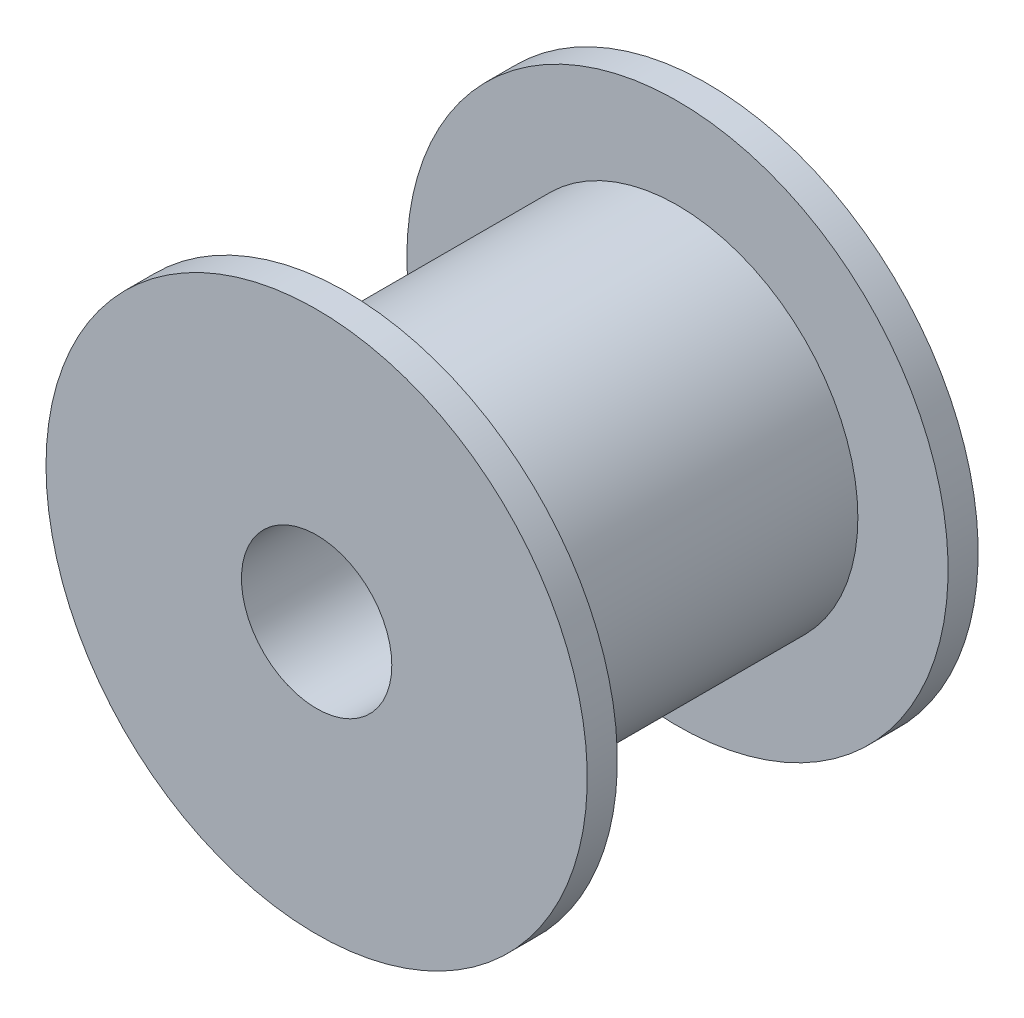
ISO-10303-21;
HEADER;
FILE_DESCRIPTION(('STEP AP214'),'2;1');
FILE_NAME('part.step','',(''),(''),'','','');
FILE_SCHEMA(('AUTOMOTIVE_DESIGN { 1 0 10303 214 1 1 1 1 }'));
ENDSEC;
DATA;
#1=APPLICATION_CONTEXT('core data for automotive mechanical design processes');
#2=APPLICATION_PROTOCOL_DEFINITION('international standard','automotive_design',2000,#1);
#3=PRODUCT_CONTEXT('',#1,'mechanical');
#4=PRODUCT('Part','Part','',(#3));
#5=PRODUCT_RELATED_PRODUCT_CATEGORY('part','',(#4));
#6=PRODUCT_DEFINITION_FORMATION('','',#4);
#7=PRODUCT_DEFINITION_CONTEXT('part definition',#1,'design');
#8=PRODUCT_DEFINITION('design','',#6,#7);
#9=PRODUCT_DEFINITION_SHAPE('','',#8);
#10=(LENGTH_UNIT() NAMED_UNIT(*) SI_UNIT(.MILLI.,.METRE.));
#11=(NAMED_UNIT(*) PLANE_ANGLE_UNIT() SI_UNIT($,.RADIAN.));
#12=(NAMED_UNIT(*) SI_UNIT($,.STERADIAN.) SOLID_ANGLE_UNIT());
#13=UNCERTAINTY_MEASURE_WITH_UNIT(LENGTH_MEASURE(1.E-05),#10,'distance_accuracy_value','');
#14=(GEOMETRIC_REPRESENTATION_CONTEXT(3) GLOBAL_UNCERTAINTY_ASSIGNED_CONTEXT((#13)) GLOBAL_UNIT_ASSIGNED_CONTEXT((#10,
#11,#12)) REPRESENTATION_CONTEXT('',''));
#15=CARTESIAN_POINT('',(0.,0.,0.));
#16=DIRECTION('',(0.,0.,1.));
#17=DIRECTION('',(1.,0.,0.));
#18=AXIS2_PLACEMENT_3D('',#15,#16,#17);
#19=CARTESIAN_POINT('',(0.,0.,13.));
#20=DIRECTION('',(0.,0.,-1.));
#21=DIRECTION('',(-1.,0.,0.));
#22=AXIS2_PLACEMENT_3D('',#19,#20,#21);
#23=CYLINDRICAL_SURFACE('',#22,9.);
#24=CARTESIAN_POINT('',(0.,0.,0.));
#25=DIRECTION('',(0.,0.,1.));
#26=DIRECTION('',(1.,0.,0.));
#27=AXIS2_PLACEMENT_3D('',#24,#25,#26);
#28=CIRCLE('',#27,9.);
#29=CARTESIAN_POINT('',(-9.,0.,0.));
#30=VERTEX_POINT('',#29);
#31=EDGE_CURVE('E46',#30,#30,#28,.T.);
#32=CARTESIAN_POINT('',(0.,0.,1.));
#33=DIRECTION('',(0.,0.,1.));
#34=DIRECTION('',(1.,0.,0.));
#35=AXIS2_PLACEMENT_3D('',#32,#33,#34);
#36=CIRCLE('',#35,9.);
#37=CARTESIAN_POINT('',(-9.,0.,1.));
#38=VERTEX_POINT('',#37);
#39=EDGE_CURVE('E53',#38,#38,#36,.T.);
#40=CARTESIAN_POINT('',(-9.,0.,0.));
#41=CARTESIAN_POINT('',(-9.,0.,0.0104166666666667));
#42=CARTESIAN_POINT('',(-9.,0.,0.0208333333333333));
#43=CARTESIAN_POINT('',(-9.,0.,0.0416666666666667));
#44=CARTESIAN_POINT('',(-9.,0.,0.0520833333333334));
#45=CARTESIAN_POINT('',(-9.,0.,0.0729166666666667));
#46=CARTESIAN_POINT('',(-9.,0.,0.0833333333333334));
#47=CARTESIAN_POINT('',(-9.,0.,0.104166666666667));
#48=CARTESIAN_POINT('',(-9.,0.,0.114583333333333));
#49=CARTESIAN_POINT('',(-9.,0.,0.135416666666667));
#50=CARTESIAN_POINT('',(-9.,0.,0.145833333333333));
#51=CARTESIAN_POINT('',(-9.,0.,0.166666666666667));
#52=CARTESIAN_POINT('',(-9.,0.,0.177083333333333));
#53=CARTESIAN_POINT('',(-9.,0.,0.197916666666667));
#54=CARTESIAN_POINT('',(-9.,0.,0.208333333333334));
#55=CARTESIAN_POINT('',(-9.,0.,0.229166666666667));
#56=CARTESIAN_POINT('',(-9.,0.,0.239583333333334));
#57=CARTESIAN_POINT('',(-9.,0.,0.260416666666667));
#58=CARTESIAN_POINT('',(-9.,0.,0.270833333333334));
#59=CARTESIAN_POINT('',(-9.,0.,0.291666666666667));
#60=CARTESIAN_POINT('',(-9.,0.,0.302083333333334));
#61=CARTESIAN_POINT('',(-9.,0.,0.322916666666667));
#62=CARTESIAN_POINT('',(-9.,0.,0.333333333333334));
#63=CARTESIAN_POINT('',(-9.,0.,0.354166666666667));
#64=CARTESIAN_POINT('',(-9.,0.,0.364583333333334));
#65=CARTESIAN_POINT('',(-9.,0.,0.385416666666667));
#66=CARTESIAN_POINT('',(-9.,0.,0.395833333333334));
#67=CARTESIAN_POINT('',(-9.,0.,0.416666666666667));
#68=CARTESIAN_POINT('',(-9.,0.,0.427083333333334));
#69=CARTESIAN_POINT('',(-9.,0.,0.447916666666667));
#70=CARTESIAN_POINT('',(-9.,0.,0.458333333333334));
#71=CARTESIAN_POINT('',(-9.,0.,0.479166666666667));
#72=CARTESIAN_POINT('',(-9.,0.,0.489583333333334));
#73=CARTESIAN_POINT('',(-9.,0.,0.510416666666667));
#74=CARTESIAN_POINT('',(-9.,0.,0.520833333333334));
#75=CARTESIAN_POINT('',(-9.,0.,0.541666666666667));
#76=CARTESIAN_POINT('',(-9.,0.,0.552083333333334));
#77=CARTESIAN_POINT('',(-9.,0.,0.572916666666667));
#78=CARTESIAN_POINT('',(-9.,0.,0.583333333333334));
#79=CARTESIAN_POINT('',(-9.,0.,0.604166666666667));
#80=CARTESIAN_POINT('',(-9.,0.,0.614583333333334));
#81=CARTESIAN_POINT('',(-9.,0.,0.635416666666667));
#82=CARTESIAN_POINT('',(-9.,0.,0.645833333333334));
#83=CARTESIAN_POINT('',(-9.,0.,0.666666666666667));
#84=CARTESIAN_POINT('',(-9.,0.,0.677083333333334));
#85=CARTESIAN_POINT('',(-9.,0.,0.697916666666667));
#86=CARTESIAN_POINT('',(-9.,0.,0.708333333333334));
#87=CARTESIAN_POINT('',(-9.,0.,0.729166666666667));
#88=CARTESIAN_POINT('',(-9.,0.,0.739583333333334));
#89=CARTESIAN_POINT('',(-9.,0.,0.760416666666667));
#90=CARTESIAN_POINT('',(-9.,0.,0.770833333333334));
#91=CARTESIAN_POINT('',(-9.,0.,0.791666666666667));
#92=CARTESIAN_POINT('',(-9.,0.,0.802083333333334));
#93=CARTESIAN_POINT('',(-9.,0.,0.822916666666667));
#94=CARTESIAN_POINT('',(-9.,0.,0.833333333333334));
#95=CARTESIAN_POINT('',(-9.,0.,0.854166666666667));
#96=CARTESIAN_POINT('',(-9.,0.,0.864583333333334));
#97=CARTESIAN_POINT('',(-9.,0.,0.885416666666668));
#98=CARTESIAN_POINT('',(-9.,0.,0.895833333333334));
#99=CARTESIAN_POINT('',(-9.,0.,0.916666666666668));
#100=CARTESIAN_POINT('',(-9.,0.,0.927083333333334));
#101=CARTESIAN_POINT('',(-9.,0.,0.947916666666668));
#102=CARTESIAN_POINT('',(-9.,0.,0.958333333333334));
#103=CARTESIAN_POINT('',(-9.,0.,0.979166666666668));
#104=CARTESIAN_POINT('',(-9.,0.,0.989583333333334));
#105=CARTESIAN_POINT('',(-9.,0.,1.));
#106=B_SPLINE_CURVE_WITH_KNOTS('',3,(#40,#41,#42,#43,#44,#45,#46,#47,#48,#49,#50,#51,#52,#53,
#54,#55,#56,#57,#58,#59,#60,#61,#62,#63,#64,#65,#66,#67,#68,#69,#70,#71,#72,#73,#74,#75,#76,#77,
#78,#79,#80,#81,#82,#83,#84,#85,#86,#87,#88,#89,#90,#91,#92,#93,#94,#95,#96,#97,#98,#99,#100,
#101,#102,#103,#104,#105),.UNSPECIFIED.,.F.,.F.,(4,2,2,2,2,2,2,2,2,2,2,2,2,2,2,2,2,2,2,2,2,2,2,
2,2,2,2,2,2,2,2,2,4),(0.,0.03125,0.0625000000000001,0.0937500000000001,0.125,0.15625,0.1875,
0.21875,0.25,0.28125,0.3125,0.34375,0.375,0.40625,0.4375,0.46875,0.5,0.53125,0.5625,
0.593750000000001,0.625000000000001,0.656250000000001,0.687500000000001,0.718750000000001,
0.750000000000001,0.781250000000001,0.812500000000001,0.843750000000001,0.875000000000001,
0.906250000000001,0.937500000000001,0.968750000000001,1.),.UNSPECIFIED.);
#107=EDGE_CURVE('BSEAM42',#30,#38,#106,.T.);
#108=ORIENTED_EDGE('',*,*,#31,.T.);
#109=ORIENTED_EDGE('',*,*,#39,.F.);
#110=ORIENTED_EDGE('',*,*,#107,.T.);
#111=ORIENTED_EDGE('',*,*,#107,.F.);
#112=EDGE_LOOP('',(#108,#110,#109,#111));
#113=FACE_BOUND('',#112,.T.);
#114=ADVANCED_FACE('F42',(#113),#23,.T.);
#115=CARTESIAN_POINT('',(0.,0.,0.));
#116=DIRECTION('',(0.,0.,1.));
#117=DIRECTION('',(1.,0.,0.));
#118=AXIS2_PLACEMENT_3D('',#115,#116,#117);
#119=PLANE('',#118);
#120=CARTESIAN_POINT('',(0.,0.,0.));
#121=DIRECTION('',(0.,0.,1.));
#122=DIRECTION('',(1.,0.,0.));
#123=AXIS2_PLACEMENT_3D('',#120,#121,#122);
#124=CIRCLE('',#123,2.5);
#125=CARTESIAN_POINT('',(2.5,0.,0.));
#126=VERTEX_POINT('',#125);
#127=EDGE_CURVE('E64',#126,#126,#124,.T.);
#128=ORIENTED_EDGE('',*,*,#127,.T.);
#129=EDGE_LOOP('',(#128));
#130=FACE_BOUND('',#129,.T.);
#131=ORIENTED_EDGE('',*,*,#31,.F.);
#132=EDGE_LOOP('',(#131));
#133=FACE_BOUND('',#132,.T.);
#134=ADVANCED_FACE('F73',(#130,#133),#119,.F.);
#135=CARTESIAN_POINT('',(0.,0.,1.));
#136=DIRECTION('',(0.,0.,1.));
#137=DIRECTION('',(1.,0.,0.));
#138=AXIS2_PLACEMENT_3D('',#135,#136,#137);
#139=PLANE('',#138);
#140=CARTESIAN_POINT('',(0.,0.,1.));
#141=DIRECTION('',(0.,0.,1.));
#142=DIRECTION('',(1.,0.,0.));
#143=AXIS2_PLACEMENT_3D('',#140,#141,#142);
#144=CIRCLE('',#143,6.);
#145=CARTESIAN_POINT('',(6.,0.,1.));
#146=VERTEX_POINT('',#145);
#147=EDGE_CURVE('E58',#146,#146,#144,.T.);
#148=ORIENTED_EDGE('',*,*,#147,.F.);
#149=EDGE_LOOP('',(#148));
#150=FACE_BOUND('',#149,.T.);
#151=ORIENTED_EDGE('',*,*,#39,.T.);
#152=EDGE_LOOP('',(#151));
#153=FACE_BOUND('',#152,.T.);
#154=ADVANCED_FACE('F100',(#150,#153),#139,.T.);
#155=CARTESIAN_POINT('',(0.,0.,12.));
#156=DIRECTION('',(0.,0.,1.));
#157=DIRECTION('',(1.,0.,0.));
#158=AXIS2_PLACEMENT_3D('',#155,#156,#157);
#159=PLANE('',#158);
#160=CARTESIAN_POINT('',(0.,0.,12.));
#161=DIRECTION('',(0.,0.,1.));
#162=DIRECTION('',(1.,0.,0.));
#163=AXIS2_PLACEMENT_3D('',#160,#161,#162);
#164=CIRCLE('',#163,6.);
#165=CARTESIAN_POINT('',(6.,0.,12.));
#166=VERTEX_POINT('',#165);
#167=EDGE_CURVE('E61',#166,#166,#164,.T.);
#168=ORIENTED_EDGE('',*,*,#167,.T.);
#169=EDGE_LOOP('',(#168));
#170=FACE_BOUND('',#169,.T.);
#171=CARTESIAN_POINT('',(0.,0.,12.));
#172=DIRECTION('',(0.,0.,1.));
#173=DIRECTION('',(1.,0.,0.));
#174=AXIS2_PLACEMENT_3D('',#171,#172,#173);
#175=CIRCLE('',#174,9.);
#176=CARTESIAN_POINT('',(-9.,0.,12.));
#177=VERTEX_POINT('',#176);
#178=EDGE_CURVE('E55',#177,#177,#175,.T.);
#179=ORIENTED_EDGE('',*,*,#178,.F.);
#180=EDGE_LOOP('',(#179));
#181=FACE_BOUND('',#180,.T.);
#182=ADVANCED_FACE('F91',(#170,#181),#159,.F.);
#183=CARTESIAN_POINT('',(0.,0.,1.));
#184=DIRECTION('',(0.,0.,1.));
#185=DIRECTION('',(1.,0.,0.));
#186=AXIS2_PLACEMENT_3D('',#183,#184,#185);
#187=CYLINDRICAL_SURFACE('',#186,6.);
#188=ORIENTED_EDGE('',*,*,#147,.T.);
#189=EDGE_LOOP('',(#188));
#190=FACE_BOUND('',#189,.T.);
#191=ORIENTED_EDGE('',*,*,#167,.F.);
#192=EDGE_LOOP('',(#191));
#193=FACE_BOUND('',#192,.T.);
#194=ADVANCED_FACE('F84',(#190,#193),#187,.T.);
#195=CARTESIAN_POINT('',(0.,0.,13.));
#196=DIRECTION('',(0.,0.,1.));
#197=DIRECTION('',(1.,0.,0.));
#198=AXIS2_PLACEMENT_3D('',#195,#196,#197);
#199=PLANE('',#198);
#200=CARTESIAN_POINT('',(0.,0.,13.));
#201=DIRECTION('',(0.,0.,1.));
#202=DIRECTION('',(1.,0.,0.));
#203=AXIS2_PLACEMENT_3D('',#200,#201,#202);
#204=CIRCLE('',#203,2.5);
#205=CARTESIAN_POINT('',(2.5,0.,13.));
#206=VERTEX_POINT('',#205);
#207=EDGE_CURVE('E67',#206,#206,#204,.T.);
#208=ORIENTED_EDGE('',*,*,#207,.F.);
#209=EDGE_LOOP('',(#208));
#210=FACE_BOUND('',#209,.T.);
#211=CARTESIAN_POINT('',(0.,0.,13.));
#212=DIRECTION('',(0.,0.,1.));
#213=DIRECTION('',(1.,0.,0.));
#214=AXIS2_PLACEMENT_3D('',#211,#212,#213);
#215=CIRCLE('',#214,9.);
#216=CARTESIAN_POINT('',(-9.,0.,13.));
#217=VERTEX_POINT('',#216);
#218=EDGE_CURVE('E11',#217,#217,#215,.T.);
#219=ORIENTED_EDGE('',*,*,#218,.T.);
#220=EDGE_LOOP('',(#219));
#221=FACE_BOUND('',#220,.T.);
#222=ADVANCED_FACE('F82',(#210,#221),#199,.T.);
#223=CARTESIAN_POINT('',(-9.,0.,12.));
#224=CARTESIAN_POINT('',(-9.,0.,12.0104166666667));
#225=CARTESIAN_POINT('',(-9.,0.,12.0208333333333));
#226=CARTESIAN_POINT('',(-9.,0.,12.0416666666667));
#227=CARTESIAN_POINT('',(-9.,0.,12.0520833333333));
#228=CARTESIAN_POINT('',(-9.,0.,12.0729166666667));
#229=CARTESIAN_POINT('',(-9.,0.,12.0833333333333));
#230=CARTESIAN_POINT('',(-9.,0.,12.1041666666667));
#231=CARTESIAN_POINT('',(-9.,0.,12.1145833333333));
#232=CARTESIAN_POINT('',(-9.,0.,12.1354166666667));
#233=CARTESIAN_POINT('',(-9.,0.,12.1458333333333));
#234=CARTESIAN_POINT('',(-9.,0.,12.1666666666667));
#235=CARTESIAN_POINT('',(-9.,0.,12.1770833333333));
#236=CARTESIAN_POINT('',(-9.,0.,12.1979166666667));
#237=CARTESIAN_POINT('',(-9.,0.,12.2083333333333));
#238=CARTESIAN_POINT('',(-9.,0.,12.2291666666667));
#239=CARTESIAN_POINT('',(-9.,0.,12.2395833333333));
#240=CARTESIAN_POINT('',(-9.,0.,12.2604166666667));
#241=CARTESIAN_POINT('',(-9.,0.,12.2708333333333));
#242=CARTESIAN_POINT('',(-9.,0.,12.2916666666667));
#243=CARTESIAN_POINT('',(-9.,0.,12.3020833333333));
#244=CARTESIAN_POINT('',(-9.,0.,12.3229166666667));
#245=CARTESIAN_POINT('',(-9.,0.,12.3333333333333));
#246=CARTESIAN_POINT('',(-9.,0.,12.3541666666667));
#247=CARTESIAN_POINT('',(-9.,0.,12.3645833333333));
#248=CARTESIAN_POINT('',(-9.,0.,12.3854166666667));
#249=CARTESIAN_POINT('',(-9.,0.,12.3958333333333));
#250=CARTESIAN_POINT('',(-9.,0.,12.4166666666667));
#251=CARTESIAN_POINT('',(-9.,0.,12.4270833333333));
#252=CARTESIAN_POINT('',(-9.,0.,12.4479166666667));
#253=CARTESIAN_POINT('',(-9.,0.,12.4583333333333));
#254=CARTESIAN_POINT('',(-9.,0.,12.4791666666667));
#255=CARTESIAN_POINT('',(-9.,0.,12.4895833333333));
#256=CARTESIAN_POINT('',(-9.,0.,12.5104166666667));
#257=CARTESIAN_POINT('',(-9.,0.,12.5208333333333));
#258=CARTESIAN_POINT('',(-9.,0.,12.5416666666667));
#259=CARTESIAN_POINT('',(-9.,0.,12.5520833333333));
#260=CARTESIAN_POINT('',(-9.,0.,12.5729166666667));
#261=CARTESIAN_POINT('',(-9.,0.,12.5833333333333));
#262=CARTESIAN_POINT('',(-9.,0.,12.6041666666667));
#263=CARTESIAN_POINT('',(-9.,0.,12.6145833333333));
#264=CARTESIAN_POINT('',(-9.,0.,12.6354166666667));
#265=CARTESIAN_POINT('',(-9.,0.,12.6458333333333));
#266=CARTESIAN_POINT('',(-9.,0.,12.6666666666667));
#267=CARTESIAN_POINT('',(-9.,0.,12.6770833333333));
#268=CARTESIAN_POINT('',(-9.,0.,12.6979166666667));
#269=CARTESIAN_POINT('',(-9.,0.,12.7083333333333));
#270=CARTESIAN_POINT('',(-9.,0.,12.7291666666667));
#271=CARTESIAN_POINT('',(-9.,0.,12.7395833333333));
#272=CARTESIAN_POINT('',(-9.,0.,12.7604166666667));
#273=CARTESIAN_POINT('',(-9.,0.,12.7708333333333));
#274=CARTESIAN_POINT('',(-9.,0.,12.7916666666667));
#275=CARTESIAN_POINT('',(-9.,0.,12.8020833333333));
#276=CARTESIAN_POINT('',(-9.,0.,12.8229166666667));
#277=CARTESIAN_POINT('',(-9.,0.,12.8333333333333));
#278=CARTESIAN_POINT('',(-9.,0.,12.8541666666667));
#279=CARTESIAN_POINT('',(-9.,0.,12.8645833333333));
#280=CARTESIAN_POINT('',(-9.,0.,12.8854166666667));
#281=CARTESIAN_POINT('',(-9.,0.,12.8958333333333));
#282=CARTESIAN_POINT('',(-9.,0.,12.9166666666667));
#283=CARTESIAN_POINT('',(-9.,0.,12.9270833333333));
#284=CARTESIAN_POINT('',(-9.,0.,12.9479166666667));
#285=CARTESIAN_POINT('',(-9.,0.,12.9583333333333));
#286=CARTESIAN_POINT('',(-9.,0.,12.9791666666667));
#287=CARTESIAN_POINT('',(-9.,0.,12.9895833333333));
#288=CARTESIAN_POINT('',(-9.,0.,13.));
#289=B_SPLINE_CURVE_WITH_KNOTS('',3,(#223,#224,#225,#226,#227,#228,#229,#230,#231,#232,#233,
#234,#235,#236,#237,#238,#239,#240,#241,#242,#243,#244,#245,#246,#247,#248,#249,#250,#251,#252,
#253,#254,#255,#256,#257,#258,#259,#260,#261,#262,#263,#264,#265,#266,#267,#268,#269,#270,#271,
#272,#273,#274,#275,#276,#277,#278,#279,#280,#281,#282,#283,#284,#285,#286,#287,#288),
.UNSPECIFIED.,.F.,.F.,(4,2,2,2,2,2,2,2,2,2,2,2,2,2,2,2,2,2,2,2,2,2,2,2,2,2,2,2,2,2,2,2,4),(0.,
0.03125,0.0625000000000001,0.0937500000000001,0.125,0.15625,0.1875,0.21875,0.25,0.28125,0.3125,
0.34375,0.375,0.40625,0.4375,0.46875,0.5,0.53125,0.5625,0.593750000000001,0.625000000000001,
0.656250000000001,0.687500000000001,0.718750000000001,0.750000000000001,0.781250000000001,
0.812500000000001,0.843750000000001,0.875000000000001,0.906250000000001,0.937500000000001,
0.968750000000001,1.),.UNSPECIFIED.);
#290=EDGE_CURVE('BSEAM44',#177,#217,#289,.T.);
#291=ORIENTED_EDGE('',*,*,#178,.T.);
#292=ORIENTED_EDGE('',*,*,#218,.F.);
#293=ORIENTED_EDGE('',*,*,#290,.T.);
#294=ORIENTED_EDGE('',*,*,#290,.F.);
#295=EDGE_LOOP('',(#291,#293,#292,#294));
#296=FACE_BOUND('',#295,.T.);
#297=ADVANCED_FACE('F44',(#296),#23,.T.);
#298=CARTESIAN_POINT('',(0.,0.,0.));
#299=DIRECTION('',(0.,0.,1.));
#300=DIRECTION('',(1.,0.,0.));
#301=AXIS2_PLACEMENT_3D('',#298,#299,#300);
#302=CYLINDRICAL_SURFACE('',#301,2.5);
#303=CARTESIAN_POINT('',(2.5,0.,0.));
#304=CARTESIAN_POINT('',(2.5,0.,0.135416666666666));
#305=CARTESIAN_POINT('',(2.5,0.,0.270833333333333));
#306=CARTESIAN_POINT('',(2.5,0.,0.541666666666667));
#307=CARTESIAN_POINT('',(2.5,0.,0.677083333333333));
#308=CARTESIAN_POINT('',(2.5,0.,0.947916666666667));
#309=CARTESIAN_POINT('',(2.5,0.,1.08333333333333));
#310=CARTESIAN_POINT('',(2.5,0.,1.35416666666667));
#311=CARTESIAN_POINT('',(2.5,0.,1.48958333333333));
#312=CARTESIAN_POINT('',(2.5,0.,1.76041666666667));
#313=CARTESIAN_POINT('',(2.5,0.,1.89583333333333));
#314=CARTESIAN_POINT('',(2.5,0.,2.16666666666667));
#315=CARTESIAN_POINT('',(2.5,0.,2.30208333333333));
#316=CARTESIAN_POINT('',(2.5,0.,2.57291666666667));
#317=CARTESIAN_POINT('',(2.5,0.,2.70833333333333));
#318=CARTESIAN_POINT('',(2.5,0.,2.97916666666667));
#319=CARTESIAN_POINT('',(2.5,0.,3.11458333333333));
#320=CARTESIAN_POINT('',(2.5,0.,3.38541666666667));
#321=CARTESIAN_POINT('',(2.5,0.,3.52083333333333));
#322=CARTESIAN_POINT('',(2.5,0.,3.79166666666667));
#323=CARTESIAN_POINT('',(2.5,0.,3.92708333333333));
#324=CARTESIAN_POINT('',(2.5,0.,4.19791666666667));
#325=CARTESIAN_POINT('',(2.5,0.,4.33333333333333));
#326=CARTESIAN_POINT('',(2.5,0.,4.60416666666667));
#327=CARTESIAN_POINT('',(2.5,0.,4.73958333333333));
#328=CARTESIAN_POINT('',(2.5,0.,5.01041666666667));
#329=CARTESIAN_POINT('',(2.5,0.,5.14583333333333));
#330=CARTESIAN_POINT('',(2.5,0.,5.41666666666667));
#331=CARTESIAN_POINT('',(2.5,0.,5.55208333333333));
#332=CARTESIAN_POINT('',(2.5,0.,5.82291666666667));
#333=CARTESIAN_POINT('',(2.5,0.,5.95833333333333));
#334=CARTESIAN_POINT('',(2.5,0.,6.22916666666667));
#335=CARTESIAN_POINT('',(2.5,0.,6.36458333333333));
#336=CARTESIAN_POINT('',(2.5,0.,6.63541666666667));
#337=CARTESIAN_POINT('',(2.5,0.,6.77083333333333));
#338=CARTESIAN_POINT('',(2.5,0.,7.04166666666667));
#339=CARTESIAN_POINT('',(2.5,0.,7.17708333333333));
#340=CARTESIAN_POINT('',(2.5,0.,7.44791666666667));
#341=CARTESIAN_POINT('',(2.5,0.,7.58333333333333));
#342=CARTESIAN_POINT('',(2.5,0.,7.85416666666667));
#343=CARTESIAN_POINT('',(2.5,0.,7.98958333333333));
#344=CARTESIAN_POINT('',(2.5,0.,8.26041666666667));
#345=CARTESIAN_POINT('',(2.5,0.,8.39583333333333));
#346=CARTESIAN_POINT('',(2.5,0.,8.66666666666667));
#347=CARTESIAN_POINT('',(2.5,0.,8.80208333333333));
#348=CARTESIAN_POINT('',(2.5,0.,9.07291666666667));
#349=CARTESIAN_POINT('',(2.5,0.,9.20833333333333));
#350=CARTESIAN_POINT('',(2.5,0.,9.47916666666667));
#351=CARTESIAN_POINT('',(2.5,0.,9.61458333333333));
#352=CARTESIAN_POINT('',(2.5,0.,9.88541666666667));
#353=CARTESIAN_POINT('',(2.5,0.,10.0208333333333));
#354=CARTESIAN_POINT('',(2.5,0.,10.2916666666667));
#355=CARTESIAN_POINT('',(2.5,0.,10.4270833333333));
#356=CARTESIAN_POINT('',(2.5,0.,10.6979166666667));
#357=CARTESIAN_POINT('',(2.5,0.,10.8333333333333));
#358=CARTESIAN_POINT('',(2.5,0.,11.1041666666667));
#359=CARTESIAN_POINT('',(2.5,0.,11.2395833333333));
#360=CARTESIAN_POINT('',(2.5,0.,11.5104166666667));
#361=CARTESIAN_POINT('',(2.5,0.,11.6458333333333));
#362=CARTESIAN_POINT('',(2.5,0.,11.9166666666667));
#363=CARTESIAN_POINT('',(2.5,0.,12.0520833333333));
#364=CARTESIAN_POINT('',(2.5,0.,12.3229166666667));
#365=CARTESIAN_POINT('',(2.5,0.,12.4583333333333));
#366=CARTESIAN_POINT('',(2.5,0.,12.7291666666667));
#367=CARTESIAN_POINT('',(2.5,0.,12.8645833333333));
#368=CARTESIAN_POINT('',(2.5,0.,13.));
#369=B_SPLINE_CURVE_WITH_KNOTS('',3,(#303,#304,#305,#306,#307,#308,#309,#310,#311,#312,#313,
#314,#315,#316,#317,#318,#319,#320,#321,#322,#323,#324,#325,#326,#327,#328,#329,#330,#331,#332,
#333,#334,#335,#336,#337,#338,#339,#340,#341,#342,#343,#344,#345,#346,#347,#348,#349,#350,#351,
#352,#353,#354,#355,#356,#357,#358,#359,#360,#361,#362,#363,#364,#365,#366,#367,#368),
.UNSPECIFIED.,.F.,.F.,(4,2,2,2,2,2,2,2,2,2,2,2,2,2,2,2,2,2,2,2,2,2,2,2,2,2,2,2,2,2,2,2,4),(0.,
0.40625,0.8125,1.21875,1.625,2.03125,2.4375,2.84375,3.25,3.65625,4.0625,4.46875,4.875,5.28125,
5.6875,6.09375,6.5,6.90625,7.3125,7.71875,8.125,8.53125,8.9375,9.34375,9.75,10.15625,10.5625,
10.96875,11.375,11.78125,12.1875,12.59375,13.),.UNSPECIFIED.);
#370=EDGE_CURVE('BSEAM76',#126,#206,#369,.T.);
#371=ORIENTED_EDGE('',*,*,#127,.F.);
#372=ORIENTED_EDGE('',*,*,#207,.T.);
#373=ORIENTED_EDGE('',*,*,#370,.T.);
#374=ORIENTED_EDGE('',*,*,#370,.F.);
#375=EDGE_LOOP('',(#371,#373,#372,#374));
#376=FACE_BOUND('',#375,.T.);
#377=ADVANCED_FACE('F76',(#376),#302,.F.);
#378=CLOSED_SHELL('',(#114,#134,#154,#182,#194,#222,#297,#377));
#379=MANIFOLD_SOLID_BREP('B2',#378);
#380=ADVANCED_BREP_SHAPE_REPRESENTATION('',(#18,#379),#14);
#381=SHAPE_DEFINITION_REPRESENTATION(#9,#380);
ENDSEC;
END-ISO-10303-21;
